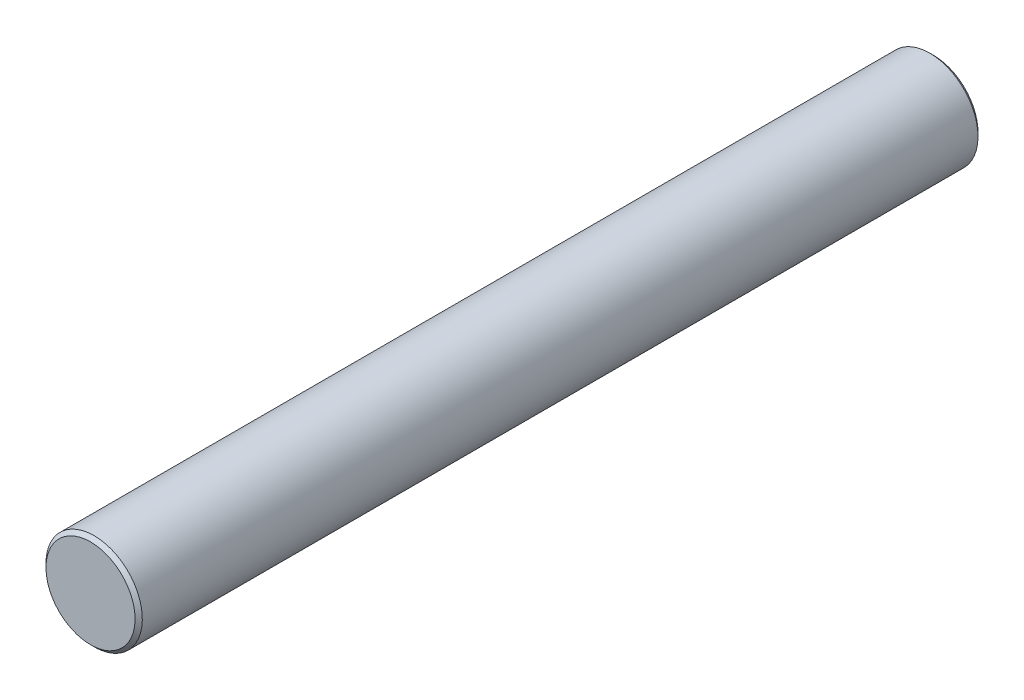
ISO-10303-21;
HEADER;
FILE_DESCRIPTION(('STEP AP214'),'2;1');
FILE_NAME('part.step','',(''),(''),'','','');
FILE_SCHEMA(('AUTOMOTIVE_DESIGN { 1 0 10303 214 1 1 1 1 }'));
ENDSEC;
DATA;
#1=APPLICATION_CONTEXT('core data for automotive mechanical design processes');
#2=APPLICATION_PROTOCOL_DEFINITION('international standard','automotive_design',2000,#1);
#3=PRODUCT_CONTEXT('',#1,'mechanical');
#4=PRODUCT('Part','Part','',(#3));
#5=PRODUCT_RELATED_PRODUCT_CATEGORY('part','',(#4));
#6=PRODUCT_DEFINITION_FORMATION('','',#4);
#7=PRODUCT_DEFINITION_CONTEXT('part definition',#1,'design');
#8=PRODUCT_DEFINITION('design','',#6,#7);
#9=PRODUCT_DEFINITION_SHAPE('','',#8);
#10=(LENGTH_UNIT() NAMED_UNIT(*) SI_UNIT(.MILLI.,.METRE.));
#11=(NAMED_UNIT(*) PLANE_ANGLE_UNIT() SI_UNIT($,.RADIAN.));
#12=(NAMED_UNIT(*) SI_UNIT($,.STERADIAN.) SOLID_ANGLE_UNIT());
#13=UNCERTAINTY_MEASURE_WITH_UNIT(LENGTH_MEASURE(1.E-05),#10,'distance_accuracy_value','');
#14=(GEOMETRIC_REPRESENTATION_CONTEXT(3) GLOBAL_UNCERTAINTY_ASSIGNED_CONTEXT((#13)) GLOBAL_UNIT_ASSIGNED_CONTEXT((#10,
#11,#12)) REPRESENTATION_CONTEXT('',''));
#15=CARTESIAN_POINT('',(0.,0.,0.));
#16=DIRECTION('',(0.,0.,1.));
#17=DIRECTION('',(1.,0.,0.));
#18=AXIS2_PLACEMENT_3D('',#15,#16,#17);
#19=CARTESIAN_POINT('',(0.,9.25,0.));
#20=DIRECTION('',(0.,0.,-1.));
#21=DIRECTION('',(0.,1.,0.));
#22=AXIS2_PLACEMENT_3D('',#19,#20,#21);
#23=PLANE('',#22);
#24=CARTESIAN_POINT('',(0.,0.,0.));
#25=DIRECTION('',(0.,0.,-1.));
#26=DIRECTION('',(0.,1.,0.));
#27=AXIS2_PLACEMENT_3D('',#24,#25,#26);
#28=CIRCLE('',#27,18.5);
#29=CARTESIAN_POINT('',(0.,18.5,0.));
#30=VERTEX_POINT('',#29);
#31=EDGE_CURVE('E9',#30,#30,#28,.T.);
#32=ORIENTED_EDGE('',*,*,#31,.T.);
#33=EDGE_LOOP('',(#32));
#34=FACE_BOUND('',#33,.T.);
#35=CARTESIAN_POINT('',(0.,0.,0.));
#36=DIRECTION('',(0.,0.,1.));
#37=DIRECTION('',(-1.,0.,0.));
#38=AXIS2_PLACEMENT_3D('',#35,#36,#37);
#39=CIRCLE('',#38,6.);
#40=CARTESIAN_POINT('',(-6.,0.,0.));
#41=VERTEX_POINT('',#40);
#42=EDGE_CURVE('E52',#41,#41,#39,.T.);
#43=ORIENTED_EDGE('',*,*,#42,.T.);
#44=EDGE_LOOP('',(#43));
#45=FACE_BOUND('',#44,.T.);
#46=ADVANCED_FACE('F15',(#34,#45),#23,.T.);
#47=CARTESIAN_POINT('',(0.,0.,0.75));
#48=DIRECTION('',(0.,0.,1.));
#49=DIRECTION('',(0.,1.,0.));
#50=AXIS2_PLACEMENT_3D('',#47,#48,#49);
#51=CONICAL_SURFACE('',#50,19.25,0.785398163397448);
#52=CARTESIAN_POINT('',(0.,0.,1.5));
#53=DIRECTION('',(0.,0.,-1.));
#54=DIRECTION('',(0.,1.,0.));
#55=AXIS2_PLACEMENT_3D('',#52,#53,#54);
#56=CIRCLE('',#55,20.);
#57=CARTESIAN_POINT('',(0.,20.,1.5));
#58=VERTEX_POINT('',#57);
#59=EDGE_CURVE('E25',#58,#58,#56,.T.);
#60=ORIENTED_EDGE('',*,*,#59,.T.);
#61=EDGE_LOOP('',(#60));
#62=FACE_BOUND('',#61,.T.);
#63=ORIENTED_EDGE('',*,*,#31,.F.);
#64=EDGE_LOOP('',(#63));
#65=FACE_BOUND('',#64,.T.);
#66=ADVANCED_FACE('F121',(#62,#65),#51,.T.);
#67=CARTESIAN_POINT('',(0.,0.,175.));
#68=DIRECTION('',(0.,0.,1.));
#69=DIRECTION('',(0.,1.,0.));
#70=AXIS2_PLACEMENT_3D('',#67,#68,#69);
#71=CYLINDRICAL_SURFACE('',#70,20.);
#72=CARTESIAN_POINT('',(0.,0.,348.5));
#73=DIRECTION('',(0.,0.,-1.));
#74=DIRECTION('',(0.,1.,0.));
#75=AXIS2_PLACEMENT_3D('',#72,#73,#74);
#76=CIRCLE('',#75,20.);
#77=CARTESIAN_POINT('',(0.,20.,348.5));
#78=VERTEX_POINT('',#77);
#79=EDGE_CURVE('E19',#78,#78,#76,.T.);
#80=ORIENTED_EDGE('',*,*,#79,.T.);
#81=EDGE_LOOP('',(#80));
#82=FACE_BOUND('',#81,.T.);
#83=ORIENTED_EDGE('',*,*,#59,.F.);
#84=EDGE_LOOP('',(#83));
#85=FACE_BOUND('',#84,.T.);
#86=CARTESIAN_POINT('',(0.,0.,6.5));
#87=DIRECTION('',(0.,0.,-1.));
#88=DIRECTION('',(0.,1.,0.));
#89=AXIS2_PLACEMENT_3D('',#86,#87,#88);
#90=CIRCLE('',#89,20.);
#91=CARTESIAN_POINT('',(10.5356537528527,-17.,6.5));
#92=VERTEX_POINT('',#91);
#93=CARTESIAN_POINT('',(-10.5356537528527,-17.,6.5));
#94=VERTEX_POINT('',#93);
#95=EDGE_CURVE('E69',#92,#94,#90,.T.);
#96=ORIENTED_EDGE('',*,*,#95,.T.);
#97=DIRECTION('',(0.,0.,1.));
#98=VECTOR('',#97,1.);
#99=CARTESIAN_POINT('',(-10.5356537528527,-17.,8.25));
#100=LINE('',#99,#98);
#101=CARTESIAN_POINT('',(-10.5356537528527,-17.,10.));
#102=VERTEX_POINT('',#101);
#103=EDGE_CURVE('E62',#94,#102,#100,.T.);
#104=ORIENTED_EDGE('',*,*,#103,.T.);
#105=CARTESIAN_POINT('',(0.,0.,10.));
#106=DIRECTION('',(0.,0.,1.));
#107=DIRECTION('',(0.,1.,0.));
#108=AXIS2_PLACEMENT_3D('',#105,#106,#107);
#109=CIRCLE('',#108,20.);
#110=CARTESIAN_POINT('',(10.5356537528527,-17.,10.));
#111=VERTEX_POINT('',#110);
#112=EDGE_CURVE('E75',#102,#111,#109,.T.);
#113=ORIENTED_EDGE('',*,*,#112,.T.);
#114=DIRECTION('',(0.,0.,-1.));
#115=VECTOR('',#114,1.);
#116=CARTESIAN_POINT('',(10.5356537528527,-17.,8.25));
#117=LINE('',#116,#115);
#118=EDGE_CURVE('E60',#111,#92,#117,.T.);
#119=ORIENTED_EDGE('',*,*,#118,.T.);
#120=EDGE_LOOP('',(#96,#104,#113,#119));
#121=FACE_BOUND('',#120,.T.);
#122=ADVANCED_FACE('F17',(#82,#85,#121),#71,.T.);
#123=CARTESIAN_POINT('',(0.,0.,349.25));
#124=DIRECTION('',(0.,0.,-1.));
#125=DIRECTION('',(0.,1.,0.));
#126=AXIS2_PLACEMENT_3D('',#123,#124,#125);
#127=CONICAL_SURFACE('',#126,19.25,0.785398163397448);
#128=CARTESIAN_POINT('',(0.,0.,350.));
#129=DIRECTION('',(0.,0.,-1.));
#130=DIRECTION('',(0.,1.,0.));
#131=AXIS2_PLACEMENT_3D('',#128,#129,#130);
#132=CIRCLE('',#131,18.5);
#133=CARTESIAN_POINT('',(0.,18.5,350.));
#134=VERTEX_POINT('',#133);
#135=EDGE_CURVE('E44',#134,#134,#132,.T.);
#136=ORIENTED_EDGE('',*,*,#135,.T.);
#137=EDGE_LOOP('',(#136));
#138=FACE_BOUND('',#137,.T.);
#139=ORIENTED_EDGE('',*,*,#79,.F.);
#140=EDGE_LOOP('',(#139));
#141=FACE_BOUND('',#140,.T.);
#142=ADVANCED_FACE('F116',(#138,#141),#127,.T.);
#143=CARTESIAN_POINT('',(0.,9.25,350.));
#144=DIRECTION('',(0.,0.,1.));
#145=DIRECTION('',(0.,-1.,0.));
#146=AXIS2_PLACEMENT_3D('',#143,#144,#145);
#147=PLANE('',#146);
#148=ORIENTED_EDGE('',*,*,#135,.F.);
#149=EDGE_LOOP('',(#148));
#150=FACE_BOUND('',#149,.T.);
#151=ADVANCED_FACE('F110',(#150),#147,.T.);
#152=CARTESIAN_POINT('',(0.,0.,26.4586213285198));
#153=DIRECTION('',(0.,0.,-1.));
#154=DIRECTION('',(-1.,0.,0.));
#155=AXIS2_PLACEMENT_3D('',#152,#153,#154);
#156=CONICAL_SURFACE('',#155,2.52640625,1.0471975511966);
#157=CARTESIAN_POINT('',(0.,0.,25.));
#158=DIRECTION('',(0.,0.,1.));
#159=DIRECTION('',(-1.,0.,0.));
#160=AXIS2_PLACEMENT_3D('',#157,#158,#159);
#161=CIRCLE('',#160,5.0528125);
#162=CARTESIAN_POINT('',(-5.0528125,0.,25.));
#163=VERTEX_POINT('',#162);
#164=EDGE_CURVE('E51',#163,#163,#161,.T.);
#165=ORIENTED_EDGE('',*,*,#164,.F.);
#166=EDGE_LOOP('',(#165));
#167=FACE_BOUND('',#166,.T.);
#168=CARTESIAN_POINT('',(0.,0.,27.9172426570397));
#169=VERTEX_POINT('',#168);
#170=VERTEX_LOOP('',#169);
#171=FACE_BOUND('',#170,.T.);
#172=ADVANCED_FACE('F104',(#167,#171),#156,.F.);
#173=CARTESIAN_POINT('',(0.,0.,12.97359375));
#174=DIRECTION('',(0.,0.,-1.));
#175=DIRECTION('',(-1.,0.,0.));
#176=AXIS2_PLACEMENT_3D('',#173,#174,#175);
#177=CYLINDRICAL_SURFACE('',#176,5.0528125);
#178=CARTESIAN_POINT('',(0.,0.,0.9471875));
#179=DIRECTION('',(0.,0.,1.));
#180=DIRECTION('',(-1.,0.,0.));
#181=AXIS2_PLACEMENT_3D('',#178,#179,#180);
#182=CIRCLE('',#181,5.0528125);
#183=CARTESIAN_POINT('',(-5.0528125,0.,0.9471875));
#184=VERTEX_POINT('',#183);
#185=EDGE_CURVE('E57',#184,#184,#182,.T.);
#186=ORIENTED_EDGE('',*,*,#185,.F.);
#187=EDGE_LOOP('',(#186));
#188=FACE_BOUND('',#187,.T.);
#189=ORIENTED_EDGE('',*,*,#164,.T.);
#190=EDGE_LOOP('',(#189));
#191=FACE_BOUND('',#190,.T.);
#192=ADVANCED_FACE('F101',(#188,#191),#177,.F.);
#193=CARTESIAN_POINT('',(0.,0.,0.47359375));
#194=DIRECTION('',(0.,0.,-1.));
#195=DIRECTION('',(-1.,0.,0.));
#196=AXIS2_PLACEMENT_3D('',#193,#194,#195);
#197=CONICAL_SURFACE('',#196,5.52640625,0.785398163397448);
#198=ORIENTED_EDGE('',*,*,#42,.F.);
#199=EDGE_LOOP('',(#198));
#200=FACE_BOUND('',#199,.T.);
#201=ORIENTED_EDGE('',*,*,#185,.T.);
#202=EDGE_LOOP('',(#201));
#203=FACE_BOUND('',#202,.T.);
#204=ADVANCED_FACE('F99',(#200,#203),#197,.F.);
#205=CARTESIAN_POINT('',(0.,-17.,8.25));
#206=DIRECTION('',(0.,-1.,0.));
#207=DIRECTION('',(0.,0.,-1.));
#208=AXIS2_PLACEMENT_3D('',#205,#206,#207);
#209=PLANE('',#208);
#210=ORIENTED_EDGE('',*,*,#103,.F.);
#211=DIRECTION('',(1.,0.,0.));
#212=VECTOR('',#211,1.);
#213=CARTESIAN_POINT('',(0.,-17.,6.5));
#214=LINE('',#213,#212);
#215=EDGE_CURVE('E66',#94,#92,#214,.T.);
#216=ORIENTED_EDGE('',*,*,#215,.T.);
#217=ORIENTED_EDGE('',*,*,#118,.F.);
#218=DIRECTION('',(-1.,0.,0.));
#219=VECTOR('',#218,1.);
#220=CARTESIAN_POINT('',(0.,-17.,10.));
#221=LINE('',#220,#219);
#222=EDGE_CURVE('E72',#111,#102,#221,.T.);
#223=ORIENTED_EDGE('',*,*,#222,.T.);
#224=EDGE_LOOP('',(#210,#216,#217,#223));
#225=FACE_BOUND('',#224,.T.);
#226=ADVANCED_FACE('F131',(#225),#209,.T.);
#227=CARTESIAN_POINT('',(0.,-19.5,6.5));
#228=DIRECTION('',(0.,0.,1.));
#229=DIRECTION('',(1.,0.,0.));
#230=AXIS2_PLACEMENT_3D('',#227,#228,#229);
#231=PLANE('',#230);
#232=ORIENTED_EDGE('',*,*,#95,.F.);
#233=ORIENTED_EDGE('',*,*,#215,.F.);
#234=EDGE_LOOP('',(#232,#233));
#235=FACE_BOUND('',#234,.T.);
#236=ADVANCED_FACE('F135',(#235),#231,.T.);
#237=CARTESIAN_POINT('',(0.,-19.5,10.));
#238=DIRECTION('',(0.,0.,1.));
#239=DIRECTION('',(1.,0.,0.));
#240=AXIS2_PLACEMENT_3D('',#237,#238,#239);
#241=PLANE('',#240);
#242=ORIENTED_EDGE('',*,*,#112,.F.);
#243=ORIENTED_EDGE('',*,*,#222,.F.);
#244=EDGE_LOOP('',(#242,#243));
#245=FACE_BOUND('',#244,.T.);
#246=ADVANCED_FACE('F87',(#245),#241,.F.);
#247=CLOSED_SHELL('',(#46,#66,#122,#142,#151,#172,#192,#204,#226,#236,#246));
#248=MANIFOLD_SOLID_BREP('B1',#247);
#249=ADVANCED_BREP_SHAPE_REPRESENTATION('',(#18,#248),#14);
#250=SHAPE_DEFINITION_REPRESENTATION(#9,#249);
ENDSEC;
END-ISO-10303-21;
